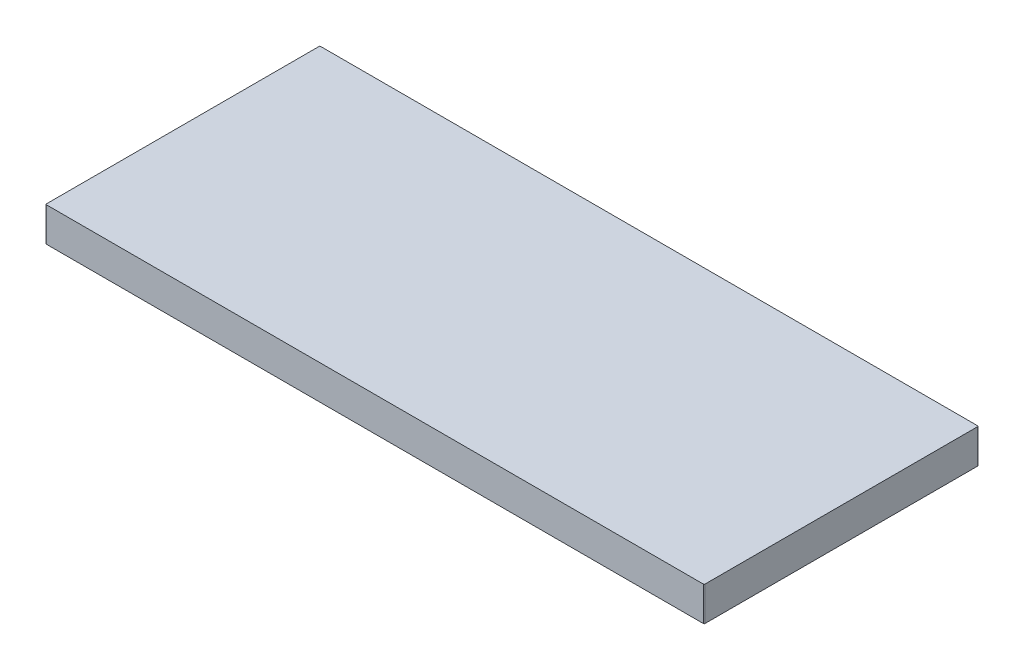
ISO-10303-21;
HEADER;
FILE_DESCRIPTION(('STEP AP214'),'2;1');
FILE_NAME('part.step','',(''),(''),'','','');
FILE_SCHEMA(('AUTOMOTIVE_DESIGN { 1 0 10303 214 1 1 1 1 }'));
ENDSEC;
DATA;
#1=APPLICATION_CONTEXT('core data for automotive mechanical design processes');
#2=APPLICATION_PROTOCOL_DEFINITION('international standard','automotive_design',2000,#1);
#3=PRODUCT_CONTEXT('',#1,'mechanical');
#4=PRODUCT('Part','Part','',(#3));
#5=PRODUCT_RELATED_PRODUCT_CATEGORY('part','',(#4));
#6=PRODUCT_DEFINITION_FORMATION('','',#4);
#7=PRODUCT_DEFINITION_CONTEXT('part definition',#1,'design');
#8=PRODUCT_DEFINITION('design','',#6,#7);
#9=PRODUCT_DEFINITION_SHAPE('','',#8);
#10=(LENGTH_UNIT() NAMED_UNIT(*) SI_UNIT(.MILLI.,.METRE.));
#11=(NAMED_UNIT(*) PLANE_ANGLE_UNIT() SI_UNIT($,.RADIAN.));
#12=(NAMED_UNIT(*) SI_UNIT($,.STERADIAN.) SOLID_ANGLE_UNIT());
#13=UNCERTAINTY_MEASURE_WITH_UNIT(LENGTH_MEASURE(1.E-05),#10,'distance_accuracy_value','');
#14=(GEOMETRIC_REPRESENTATION_CONTEXT(3) GLOBAL_UNCERTAINTY_ASSIGNED_CONTEXT((#13)) GLOBAL_UNIT_ASSIGNED_CONTEXT((#10,
#11,#12)) REPRESENTATION_CONTEXT('',''));
#15=CARTESIAN_POINT('',(0.,0.,0.));
#16=DIRECTION('',(0.,0.,1.));
#17=DIRECTION('',(1.,0.,0.));
#18=AXIS2_PLACEMENT_3D('',#15,#16,#17);
#19=CARTESIAN_POINT('',(48.15,5.,20.05));
#20=DIRECTION('',(-1.,0.,0.));
#21=DIRECTION('',(0.,0.,1.));
#22=AXIS2_PLACEMENT_3D('',#19,#20,#21);
#23=PLANE('',#22);
#24=DIRECTION('',(0.,0.,-1.));
#25=VECTOR('',#24,1.);
#26=CARTESIAN_POINT('',(48.15,0.,20.05));
#27=LINE('',#26,#25);
#28=CARTESIAN_POINT('',(48.15,0.,19.95));
#29=VERTEX_POINT('',#28);
#30=CARTESIAN_POINT('',(48.15,0.,-19.95));
#31=VERTEX_POINT('',#30);
#32=EDGE_CURVE('E127',#29,#31,#27,.T.);
#33=ORIENTED_EDGE('',*,*,#32,.T.);
#34=DIRECTION('',(0.,-1.,0.));
#35=VECTOR('',#34,1.);
#36=CARTESIAN_POINT('',(48.15,5.,-19.95));
#37=LINE('',#36,#35);
#38=CARTESIAN_POINT('',(48.15,5.,-19.95));
#39=VERTEX_POINT('',#38);
#40=EDGE_CURVE('E104',#31,#39,#37,.F.);
#41=ORIENTED_EDGE('',*,*,#40,.T.);
#42=DIRECTION('',(0.,0.,-1.));
#43=VECTOR('',#42,1.);
#44=CARTESIAN_POINT('',(48.15,5.,20.05));
#45=LINE('',#44,#43);
#46=CARTESIAN_POINT('',(48.15,5.,19.95));
#47=VERTEX_POINT('',#46);
#48=EDGE_CURVE('E136',#47,#39,#45,.T.);
#49=ORIENTED_EDGE('',*,*,#48,.F.);
#50=DIRECTION('',(0.,-1.,0.));
#51=VECTOR('',#50,1.);
#52=CARTESIAN_POINT('',(48.15,5.,19.95));
#53=LINE('',#52,#51);
#54=EDGE_CURVE('E109',#47,#29,#53,.T.);
#55=ORIENTED_EDGE('',*,*,#54,.T.);
#56=EDGE_LOOP('',(#33,#41,#49,#55));
#57=FACE_BOUND('',#56,.T.);
#58=ADVANCED_FACE('F32',(#57),#23,.F.);
#59=CARTESIAN_POINT('',(-48.15,5.,-20.05));
#60=DIRECTION('',(0.,0.,1.));
#61=DIRECTION('',(1.,0.,0.));
#62=AXIS2_PLACEMENT_3D('',#59,#60,#61);
#63=PLANE('',#62);
#64=DIRECTION('',(-1.,0.,0.));
#65=VECTOR('',#64,1.);
#66=CARTESIAN_POINT('',(-48.15,5.,-20.05));
#67=LINE('',#66,#65);
#68=CARTESIAN_POINT('',(48.05,5.,-20.05));
#69=VERTEX_POINT('',#68);
#70=CARTESIAN_POINT('',(-48.05,5.,-20.05));
#71=VERTEX_POINT('',#70);
#72=EDGE_CURVE('E119',#69,#71,#67,.T.);
#73=ORIENTED_EDGE('',*,*,#72,.F.);
#74=DIRECTION('',(0.,-1.,0.));
#75=VECTOR('',#74,1.);
#76=CARTESIAN_POINT('',(48.05,5.,-20.05));
#77=LINE('',#76,#75);
#78=CARTESIAN_POINT('',(48.05,0.,-20.05));
#79=VERTEX_POINT('',#78);
#80=EDGE_CURVE('E103',#69,#79,#77,.T.);
#81=ORIENTED_EDGE('',*,*,#80,.T.);
#82=DIRECTION('',(-1.,0.,0.));
#83=VECTOR('',#82,1.);
#84=CARTESIAN_POINT('',(-48.15,0.,-20.05));
#85=LINE('',#84,#83);
#86=CARTESIAN_POINT('',(-48.05,0.,-20.05));
#87=VERTEX_POINT('',#86);
#88=EDGE_CURVE('E116',#79,#87,#85,.T.);
#89=ORIENTED_EDGE('',*,*,#88,.T.);
#90=DIRECTION('',(0.,-1.,0.));
#91=VECTOR('',#90,1.);
#92=CARTESIAN_POINT('',(-48.05,5.,-20.05));
#93=LINE('',#92,#91);
#94=EDGE_CURVE('E121',#87,#71,#93,.F.);
#95=ORIENTED_EDGE('',*,*,#94,.T.);
#96=EDGE_LOOP('',(#73,#81,#89,#95));
#97=FACE_BOUND('',#96,.T.);
#98=ADVANCED_FACE('F115',(#97),#63,.F.);
#99=CARTESIAN_POINT('',(-48.15,5.,20.05));
#100=DIRECTION('',(1.,0.,0.));
#101=DIRECTION('',(0.,0.,-1.));
#102=AXIS2_PLACEMENT_3D('',#99,#100,#101);
#103=PLANE('',#102);
#104=DIRECTION('',(0.,0.,1.));
#105=VECTOR('',#104,1.);
#106=CARTESIAN_POINT('',(-48.15,5.,20.05));
#107=LINE('',#106,#105);
#108=CARTESIAN_POINT('',(-48.15,5.,-19.95));
#109=VERTEX_POINT('',#108);
#110=CARTESIAN_POINT('',(-48.15,5.,19.95));
#111=VERTEX_POINT('',#110);
#112=EDGE_CURVE('E159',#109,#111,#107,.T.);
#113=ORIENTED_EDGE('',*,*,#112,.F.);
#114=DIRECTION('',(0.,-1.,0.));
#115=VECTOR('',#114,1.);
#116=CARTESIAN_POINT('',(-48.15,5.,-19.95));
#117=LINE('',#116,#115);
#118=CARTESIAN_POINT('',(-48.15,0.,-19.95));
#119=VERTEX_POINT('',#118);
#120=EDGE_CURVE('E11',#109,#119,#117,.T.);
#121=ORIENTED_EDGE('',*,*,#120,.T.);
#122=DIRECTION('',(0.,0.,1.));
#123=VECTOR('',#122,1.);
#124=CARTESIAN_POINT('',(-48.15,0.,20.05));
#125=LINE('',#124,#123);
#126=CARTESIAN_POINT('',(-48.15,0.,19.95));
#127=VERTEX_POINT('',#126);
#128=EDGE_CURVE('E126',#119,#127,#125,.T.);
#129=ORIENTED_EDGE('',*,*,#128,.T.);
#130=DIRECTION('',(0.,-1.,0.));
#131=VECTOR('',#130,1.);
#132=CARTESIAN_POINT('',(-48.15,5.,19.95));
#133=LINE('',#132,#131);
#134=EDGE_CURVE('E40',#127,#111,#133,.F.);
#135=ORIENTED_EDGE('',*,*,#134,.T.);
#136=EDGE_LOOP('',(#113,#121,#129,#135));
#137=FACE_BOUND('',#136,.T.);
#138=ADVANCED_FACE('F158',(#137),#103,.F.);
#139=CARTESIAN_POINT('',(-48.15,5.,20.05));
#140=DIRECTION('',(0.,0.,-1.));
#141=DIRECTION('',(-1.,0.,0.));
#142=AXIS2_PLACEMENT_3D('',#139,#140,#141);
#143=PLANE('',#142);
#144=DIRECTION('',(1.,0.,0.));
#145=VECTOR('',#144,1.);
#146=CARTESIAN_POINT('',(-48.15,0.,20.05));
#147=LINE('',#146,#145);
#148=CARTESIAN_POINT('',(-48.05,0.,20.05));
#149=VERTEX_POINT('',#148);
#150=CARTESIAN_POINT('',(48.05,0.,20.05));
#151=VERTEX_POINT('',#150);
#152=EDGE_CURVE('E130',#149,#151,#147,.T.);
#153=ORIENTED_EDGE('',*,*,#152,.T.);
#154=DIRECTION('',(0.,-1.,0.));
#155=VECTOR('',#154,1.);
#156=CARTESIAN_POINT('',(48.05,5.,20.05));
#157=LINE('',#156,#155);
#158=CARTESIAN_POINT('',(48.05,5.,20.05));
#159=VERTEX_POINT('',#158);
#160=EDGE_CURVE('E47',#151,#159,#157,.F.);
#161=ORIENTED_EDGE('',*,*,#160,.T.);
#162=DIRECTION('',(1.,0.,0.));
#163=VECTOR('',#162,1.);
#164=CARTESIAN_POINT('',(-48.15,5.,20.05));
#165=LINE('',#164,#163);
#166=CARTESIAN_POINT('',(-48.05,5.,20.05));
#167=VERTEX_POINT('',#166);
#168=EDGE_CURVE('E137',#167,#159,#165,.T.);
#169=ORIENTED_EDGE('',*,*,#168,.F.);
#170=DIRECTION('',(0.,-1.,0.));
#171=VECTOR('',#170,1.);
#172=CARTESIAN_POINT('',(-48.05,5.,20.05));
#173=LINE('',#172,#171);
#174=EDGE_CURVE('E152',#167,#149,#173,.T.);
#175=ORIENTED_EDGE('',*,*,#174,.T.);
#176=EDGE_LOOP('',(#153,#161,#169,#175));
#177=FACE_BOUND('',#176,.T.);
#178=ADVANCED_FACE('F168',(#177),#143,.F.);
#179=CARTESIAN_POINT('',(0.,5.,0.));
#180=DIRECTION('',(0.,-1.,0.));
#181=DIRECTION('',(0.,0.,-1.));
#182=AXIS2_PLACEMENT_3D('',#179,#180,#181);
#183=PLANE('',#182);
#184=ORIENTED_EDGE('',*,*,#48,.T.);
#185=CARTESIAN_POINT('',(48.05,5.,-19.95));
#186=DIRECTION('',(0.,-1.,0.));
#187=DIRECTION('',(0.,0.,-1.));
#188=AXIS2_PLACEMENT_3D('',#185,#186,#187);
#189=CIRCLE('',#188,0.1);
#190=EDGE_CURVE('E150',#39,#69,#189,.F.);
#191=ORIENTED_EDGE('',*,*,#190,.T.);
#192=ORIENTED_EDGE('',*,*,#72,.T.);
#193=CARTESIAN_POINT('',(-48.05,5.,-19.95));
#194=DIRECTION('',(0.,-1.,0.));
#195=DIRECTION('',(0.,0.,-1.));
#196=AXIS2_PLACEMENT_3D('',#193,#194,#195);
#197=CIRCLE('',#196,0.1);
#198=EDGE_CURVE('E146',#71,#109,#197,.F.);
#199=ORIENTED_EDGE('',*,*,#198,.T.);
#200=ORIENTED_EDGE('',*,*,#112,.T.);
#201=CARTESIAN_POINT('',(-48.05,5.,19.95));
#202=DIRECTION('',(0.,-1.,0.));
#203=DIRECTION('',(0.,0.,-1.));
#204=AXIS2_PLACEMENT_3D('',#201,#202,#203);
#205=CIRCLE('',#204,0.1);
#206=EDGE_CURVE('E54',#111,#167,#205,.F.);
#207=ORIENTED_EDGE('',*,*,#206,.T.);
#208=ORIENTED_EDGE('',*,*,#168,.T.);
#209=CARTESIAN_POINT('',(48.05,5.,19.95));
#210=DIRECTION('',(0.,-1.,0.));
#211=DIRECTION('',(0.,0.,-1.));
#212=AXIS2_PLACEMENT_3D('',#209,#210,#211);
#213=CIRCLE('',#212,0.1);
#214=EDGE_CURVE('E148',#159,#47,#213,.F.);
#215=ORIENTED_EDGE('',*,*,#214,.T.);
#216=EDGE_LOOP('',(#184,#191,#192,#199,#200,#207,#208,#215));
#217=FACE_BOUND('',#216,.T.);
#218=ADVANCED_FACE('F163',(#217),#183,.F.);
#219=CARTESIAN_POINT('',(0.,0.,0.));
#220=DIRECTION('',(0.,-1.,0.));
#221=DIRECTION('',(0.,0.,-1.));
#222=AXIS2_PLACEMENT_3D('',#219,#220,#221);
#223=PLANE('',#222);
#224=ORIENTED_EDGE('',*,*,#88,.F.);
#225=CARTESIAN_POINT('',(48.05,0.,-19.95));
#226=DIRECTION('',(0.,-1.,0.));
#227=DIRECTION('',(0.,0.,-1.));
#228=AXIS2_PLACEMENT_3D('',#225,#226,#227);
#229=CIRCLE('',#228,0.1);
#230=EDGE_CURVE('E99',#79,#31,#229,.T.);
#231=ORIENTED_EDGE('',*,*,#230,.T.);
#232=ORIENTED_EDGE('',*,*,#32,.F.);
#233=CARTESIAN_POINT('',(48.05,0.,19.95));
#234=DIRECTION('',(0.,-1.,0.));
#235=DIRECTION('',(0.,0.,-1.));
#236=AXIS2_PLACEMENT_3D('',#233,#234,#235);
#237=CIRCLE('',#236,0.1);
#238=EDGE_CURVE('E110',#29,#151,#237,.T.);
#239=ORIENTED_EDGE('',*,*,#238,.T.);
#240=ORIENTED_EDGE('',*,*,#152,.F.);
#241=CARTESIAN_POINT('',(-48.05,0.,19.95));
#242=DIRECTION('',(0.,-1.,0.));
#243=DIRECTION('',(0.,0.,-1.));
#244=AXIS2_PLACEMENT_3D('',#241,#242,#243);
#245=CIRCLE('',#244,0.1);
#246=EDGE_CURVE('E120',#149,#127,#245,.T.);
#247=ORIENTED_EDGE('',*,*,#246,.T.);
#248=ORIENTED_EDGE('',*,*,#128,.F.);
#249=CARTESIAN_POINT('',(-48.05,0.,-19.95));
#250=DIRECTION('',(0.,-1.,0.));
#251=DIRECTION('',(0.,0.,-1.));
#252=AXIS2_PLACEMENT_3D('',#249,#250,#251);
#253=CIRCLE('',#252,0.1);
#254=EDGE_CURVE('E125',#119,#87,#253,.T.);
#255=ORIENTED_EDGE('',*,*,#254,.T.);
#256=EDGE_LOOP('',(#224,#231,#232,#239,#240,#247,#248,#255));
#257=FACE_BOUND('',#256,.T.);
#258=ADVANCED_FACE('F123',(#257),#223,.T.);
#259=CARTESIAN_POINT('',(48.05,5.,-19.95));
#260=DIRECTION('',(0.,-1.,0.));
#261=DIRECTION('',(0.,0.,-1.));
#262=AXIS2_PLACEMENT_3D('',#259,#260,#261);
#263=CYLINDRICAL_SURFACE('',#262,0.1);
#264=ORIENTED_EDGE('',*,*,#190,.F.);
#265=ORIENTED_EDGE('',*,*,#40,.F.);
#266=ORIENTED_EDGE('',*,*,#230,.F.);
#267=ORIENTED_EDGE('',*,*,#80,.F.);
#268=EDGE_LOOP('',(#264,#265,#266,#267));
#269=FACE_BOUND('',#268,.T.);
#270=ADVANCED_FACE('F102',(#269),#263,.T.);
#271=CARTESIAN_POINT('',(48.05,5.,19.95));
#272=DIRECTION('',(0.,-1.,0.));
#273=DIRECTION('',(0.,0.,-1.));
#274=AXIS2_PLACEMENT_3D('',#271,#272,#273);
#275=CYLINDRICAL_SURFACE('',#274,0.1);
#276=ORIENTED_EDGE('',*,*,#214,.F.);
#277=ORIENTED_EDGE('',*,*,#160,.F.);
#278=ORIENTED_EDGE('',*,*,#238,.F.);
#279=ORIENTED_EDGE('',*,*,#54,.F.);
#280=EDGE_LOOP('',(#276,#277,#278,#279));
#281=FACE_BOUND('',#280,.T.);
#282=ADVANCED_FACE('F172',(#281),#275,.T.);
#283=CARTESIAN_POINT('',(-48.05,5.,-19.95));
#284=DIRECTION('',(0.,-1.,0.));
#285=DIRECTION('',(0.,0.,-1.));
#286=AXIS2_PLACEMENT_3D('',#283,#284,#285);
#287=CYLINDRICAL_SURFACE('',#286,0.1);
#288=ORIENTED_EDGE('',*,*,#198,.F.);
#289=ORIENTED_EDGE('',*,*,#94,.F.);
#290=ORIENTED_EDGE('',*,*,#254,.F.);
#291=ORIENTED_EDGE('',*,*,#120,.F.);
#292=EDGE_LOOP('',(#288,#289,#290,#291));
#293=FACE_BOUND('',#292,.T.);
#294=ADVANCED_FACE('F178',(#293),#287,.T.);
#295=CARTESIAN_POINT('',(-48.05,5.,19.95));
#296=DIRECTION('',(0.,-1.,0.));
#297=DIRECTION('',(0.,0.,-1.));
#298=AXIS2_PLACEMENT_3D('',#295,#296,#297);
#299=CYLINDRICAL_SURFACE('',#298,0.1);
#300=ORIENTED_EDGE('',*,*,#206,.F.);
#301=ORIENTED_EDGE('',*,*,#134,.F.);
#302=ORIENTED_EDGE('',*,*,#246,.F.);
#303=ORIENTED_EDGE('',*,*,#174,.F.);
#304=EDGE_LOOP('',(#300,#301,#302,#303));
#305=FACE_BOUND('',#304,.T.);
#306=ADVANCED_FACE('F34',(#305),#299,.T.);
#307=CLOSED_SHELL('',(#58,#98,#138,#178,#218,#258,#270,#282,#294,#306));
#308=MANIFOLD_SOLID_BREP('B2',#307);
#309=ADVANCED_BREP_SHAPE_REPRESENTATION('',(#18,#308),#14);
#310=SHAPE_DEFINITION_REPRESENTATION(#9,#309);
ENDSEC;
END-ISO-10303-21;
